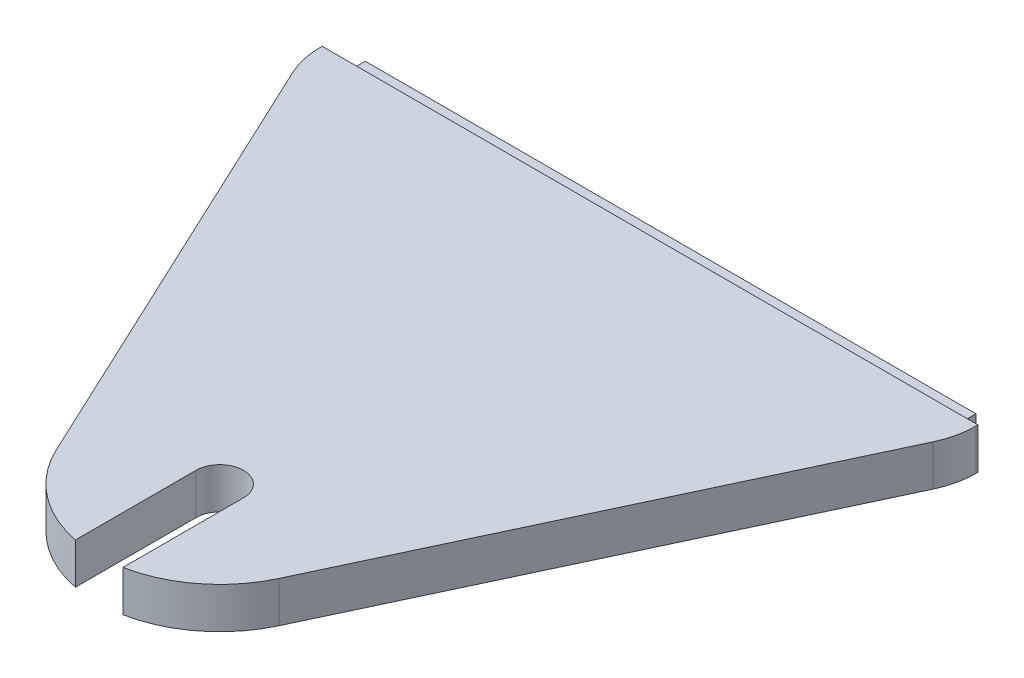
ISO-10303-21;
HEADER;
FILE_DESCRIPTION(('STEP AP214'),'2;1');
FILE_NAME('part.step','',(''),(''),'','','');
FILE_SCHEMA(('AUTOMOTIVE_DESIGN { 1 0 10303 214 1 1 1 1 }'));
ENDSEC;
DATA;
#1=APPLICATION_CONTEXT('core data for automotive mechanical design processes');
#2=APPLICATION_PROTOCOL_DEFINITION('international standard','automotive_design',2000,#1);
#3=PRODUCT_CONTEXT('',#1,'mechanical');
#4=PRODUCT('Part','Part','',(#3));
#5=PRODUCT_RELATED_PRODUCT_CATEGORY('part','',(#4));
#6=PRODUCT_DEFINITION_FORMATION('','',#4);
#7=PRODUCT_DEFINITION_CONTEXT('part definition',#1,'design');
#8=PRODUCT_DEFINITION('design','',#6,#7);
#9=PRODUCT_DEFINITION_SHAPE('','',#8);
#10=(LENGTH_UNIT() NAMED_UNIT(*) SI_UNIT(.MILLI.,.METRE.));
#11=(NAMED_UNIT(*) PLANE_ANGLE_UNIT() SI_UNIT($,.RADIAN.));
#12=(NAMED_UNIT(*) SI_UNIT($,.STERADIAN.) SOLID_ANGLE_UNIT());
#13=UNCERTAINTY_MEASURE_WITH_UNIT(LENGTH_MEASURE(1.E-05),#10,'distance_accuracy_value','');
#14=(GEOMETRIC_REPRESENTATION_CONTEXT(3) GLOBAL_UNCERTAINTY_ASSIGNED_CONTEXT((#13)) GLOBAL_UNIT_ASSIGNED_CONTEXT((#10,
#11,#12)) REPRESENTATION_CONTEXT('',''));
#15=CARTESIAN_POINT('',(0.,0.,0.));
#16=DIRECTION('',(0.,0.,1.));
#17=DIRECTION('',(1.,0.,0.));
#18=AXIS2_PLACEMENT_3D('',#15,#16,#17);
#19=CARTESIAN_POINT('',(0.,5.,50.));
#20=DIRECTION('',(0.,-1.,0.));
#21=DIRECTION('',(0.,0.,-1.));
#22=AXIS2_PLACEMENT_3D('',#19,#20,#21);
#23=CYLINDRICAL_SURFACE('',#22,15.);
#24=DIRECTION('',(0.,-1.,0.));
#25=VECTOR('',#24,1.);
#26=CARTESIAN_POINT('',(-2.9,5.,64.7169969762856));
#27=LINE('',#26,#25);
#28=CARTESIAN_POINT('',(-2.9,5.,64.7169969762856));
#29=VERTEX_POINT('',#28);
#30=CARTESIAN_POINT('',(-2.9,0.,64.7169969762856));
#31=VERTEX_POINT('',#30);
#32=EDGE_CURVE('E158',#29,#31,#27,.T.);
#33=ORIENTED_EDGE('',*,*,#32,.F.);
#34=CARTESIAN_POINT('',(0.,5.,50.));
#35=DIRECTION('',(0.,1.,0.));
#36=DIRECTION('',(0.,0.,1.));
#37=AXIS2_PLACEMENT_3D('',#34,#35,#36);
#38=CIRCLE('',#37,15.);
#39=CARTESIAN_POINT('',(-13.5822252420629,5.,56.3657801936503));
#40=VERTEX_POINT('',#39);
#41=EDGE_CURVE('E172',#40,#29,#38,.T.);
#42=ORIENTED_EDGE('',*,*,#41,.F.);
#43=DIRECTION('',(0.,-1.,0.));
#44=VECTOR('',#43,1.);
#45=CARTESIAN_POINT('',(-13.5822252420629,5.,56.3657801936503));
#46=LINE('',#45,#44);
#47=CARTESIAN_POINT('',(-13.5822252420629,0.,56.3657801936503));
#48=VERTEX_POINT('',#47);
#49=EDGE_CURVE('E192',#40,#48,#46,.T.);
#50=ORIENTED_EDGE('',*,*,#49,.T.);
#51=CARTESIAN_POINT('',(0.,0.,50.));
#52=DIRECTION('',(0.,1.,0.));
#53=DIRECTION('',(0.,0.,1.));
#54=AXIS2_PLACEMENT_3D('',#51,#52,#53);
#55=CIRCLE('',#54,15.);
#56=EDGE_CURVE('E188',#48,#31,#55,.T.);
#57=ORIENTED_EDGE('',*,*,#56,.T.);
#58=EDGE_LOOP('',(#33,#42,#50,#57));
#59=FACE_BOUND('',#58,.T.);
#60=ADVANCED_FACE('F39',(#59),#23,.T.);
#61=CARTESIAN_POINT('',(0.,0.,50.));
#62=DIRECTION('',(0.,1.,0.));
#63=DIRECTION('',(0.,0.,1.));
#64=AXIS2_PLACEMENT_3D('',#61,#62,#63);
#65=PLANE('',#64);
#66=DIRECTION('',(0.,0.,1.));
#67=VECTOR('',#66,1.);
#68=CARTESIAN_POINT('',(2.9,0.,50.));
#69=LINE('',#68,#67);
#70=CARTESIAN_POINT('',(2.9,0.,50.));
#71=VERTEX_POINT('',#70);
#72=CARTESIAN_POINT('',(2.9,0.,64.7169969762856));
#73=VERTEX_POINT('',#72);
#74=EDGE_CURVE('E152',#71,#73,#69,.T.);
#75=ORIENTED_EDGE('',*,*,#74,.F.);
#76=CARTESIAN_POINT('',(0.,0.,50.));
#77=DIRECTION('',(0.,-1.,0.));
#78=DIRECTION('',(0.,0.,-1.));
#79=AXIS2_PLACEMENT_3D('',#76,#77,#78);
#80=CIRCLE('',#79,2.9);
#81=CARTESIAN_POINT('',(-2.9,0.,50.));
#82=VERTEX_POINT('',#81);
#83=EDGE_CURVE('E276',#82,#71,#80,.T.);
#84=ORIENTED_EDGE('',*,*,#83,.F.);
#85=DIRECTION('',(0.,0.,-1.));
#86=VECTOR('',#85,1.);
#87=CARTESIAN_POINT('',(-2.9,0.,50.));
#88=LINE('',#87,#86);
#89=EDGE_CURVE('E274',#31,#82,#88,.T.);
#90=ORIENTED_EDGE('',*,*,#89,.F.);
#91=ORIENTED_EDGE('',*,*,#56,.F.);
#92=DIRECTION('',(0.424385346243353,0.,0.905481682804191));
#93=VECTOR('',#92,1.);
#94=CARTESIAN_POINT('',(-40.,0.,0.));
#95=LINE('',#94,#93);
#96=CARTESIAN_POINT('',(-39.0548168280419,0.,2.0166720097165));
#97=VERTEX_POINT('',#96);
#98=EDGE_CURVE('E180',#97,#48,#95,.T.);
#99=ORIENTED_EDGE('',*,*,#98,.F.);
#100=CARTESIAN_POINT('',(-30.,0.,-2.22718145271703));
#101=DIRECTION('',(0.,1.,0.));
#102=DIRECTION('',(0.,0.,1.));
#103=AXIS2_PLACEMENT_3D('',#100,#101,#102);
#104=CIRCLE('',#103,10.);
#105=CARTESIAN_POINT('',(-40.,0.,-2.22718145271703));
#106=VERTEX_POINT('',#105);
#107=EDGE_CURVE('E205',#97,#106,#104,.F.);
#108=ORIENTED_EDGE('',*,*,#107,.T.);
#109=DIRECTION('',(0.,0.,1.));
#110=VECTOR('',#109,1.);
#111=CARTESIAN_POINT('',(-40.,0.,-5.));
#112=LINE('',#111,#110);
#113=CARTESIAN_POINT('',(-40.,0.,-2.5));
#114=VERTEX_POINT('',#113);
#115=EDGE_CURVE('E224',#114,#106,#112,.T.);
#116=ORIENTED_EDGE('',*,*,#115,.F.);
#117=DIRECTION('',(-1.,0.,0.));
#118=VECTOR('',#117,1.);
#119=CARTESIAN_POINT('',(40.,0.,-2.5));
#120=LINE('',#119,#118);
#121=CARTESIAN_POINT('',(40.,0.,-2.5));
#122=VERTEX_POINT('',#121);
#123=EDGE_CURVE('E225',#122,#114,#120,.T.);
#124=ORIENTED_EDGE('',*,*,#123,.F.);
#125=DIRECTION('',(0.,0.,1.));
#126=VECTOR('',#125,1.);
#127=CARTESIAN_POINT('',(40.,0.,-5.));
#128=LINE('',#127,#126);
#129=CARTESIAN_POINT('',(40.,0.,-2.22718145271703));
#130=VERTEX_POINT('',#129);
#131=EDGE_CURVE('E190',#122,#130,#128,.T.);
#132=ORIENTED_EDGE('',*,*,#131,.T.);
#133=CARTESIAN_POINT('',(30.,0.,-2.22718145271703));
#134=DIRECTION('',(0.,1.,0.));
#135=DIRECTION('',(0.,0.,1.));
#136=AXIS2_PLACEMENT_3D('',#133,#134,#135);
#137=CIRCLE('',#136,10.);
#138=CARTESIAN_POINT('',(39.0548168280419,0.,2.0166720097165));
#139=VERTEX_POINT('',#138);
#140=EDGE_CURVE('E199',#130,#139,#137,.F.);
#141=ORIENTED_EDGE('',*,*,#140,.T.);
#142=DIRECTION('',(-0.424385346243353,0.,0.905481682804191));
#143=VECTOR('',#142,1.);
#144=CARTESIAN_POINT('',(40.,0.,0.));
#145=LINE('',#144,#143);
#146=CARTESIAN_POINT('',(13.5822252420629,0.,56.3657801936503));
#147=VERTEX_POINT('',#146);
#148=EDGE_CURVE('E184',#139,#147,#145,.T.);
#149=ORIENTED_EDGE('',*,*,#148,.T.);
#150=EDGE_CURVE('E186',#73,#147,#55,.T.);
#151=ORIENTED_EDGE('',*,*,#150,.F.);
#152=EDGE_LOOP('',(#75,#84,#90,#91,#99,#108,#116,#124,#132,#141,#149,#151));
#153=FACE_BOUND('',#152,.T.);
#154=ADVANCED_FACE('F218',(#153),#65,.F.);
#155=CARTESIAN_POINT('',(0.,5.,50.));
#156=DIRECTION('',(0.,1.,0.));
#157=DIRECTION('',(0.,0.,1.));
#158=AXIS2_PLACEMENT_3D('',#155,#156,#157);
#159=PLANE('',#158);
#160=ORIENTED_EDGE('',*,*,#41,.T.);
#161=DIRECTION('',(0.,0.,-1.));
#162=VECTOR('',#161,1.);
#163=CARTESIAN_POINT('',(-2.9,5.,50.));
#164=LINE('',#163,#162);
#165=CARTESIAN_POINT('',(-2.9,5.,50.));
#166=VERTEX_POINT('',#165);
#167=EDGE_CURVE('E166',#29,#166,#164,.T.);
#168=ORIENTED_EDGE('',*,*,#167,.T.);
#169=CARTESIAN_POINT('',(0.,5.,50.));
#170=DIRECTION('',(0.,-1.,0.));
#171=DIRECTION('',(0.,0.,-1.));
#172=AXIS2_PLACEMENT_3D('',#169,#170,#171);
#173=CIRCLE('',#172,2.9);
#174=CARTESIAN_POINT('',(2.9,5.,50.));
#175=VERTEX_POINT('',#174);
#176=EDGE_CURVE('E169',#166,#175,#173,.T.);
#177=ORIENTED_EDGE('',*,*,#176,.T.);
#178=DIRECTION('',(0.,0.,1.));
#179=VECTOR('',#178,1.);
#180=CARTESIAN_POINT('',(2.9,5.,50.));
#181=LINE('',#180,#179);
#182=CARTESIAN_POINT('',(2.9,5.,64.7169969762856));
#183=VERTEX_POINT('',#182);
#184=EDGE_CURVE('E53',#175,#183,#181,.T.);
#185=ORIENTED_EDGE('',*,*,#184,.T.);
#186=CARTESIAN_POINT('',(13.5822252420629,5.,56.3657801936503));
#187=VERTEX_POINT('',#186);
#188=EDGE_CURVE('E163',#183,#187,#38,.T.);
#189=ORIENTED_EDGE('',*,*,#188,.T.);
#190=DIRECTION('',(-0.424385346243353,0.,0.905481682804191));
#191=VECTOR('',#190,1.);
#192=CARTESIAN_POINT('',(40.,5.,0.));
#193=LINE('',#192,#191);
#194=CARTESIAN_POINT('',(39.0548168280419,5.,2.0166720097165));
#195=VERTEX_POINT('',#194);
#196=EDGE_CURVE('E178',#195,#187,#193,.T.);
#197=ORIENTED_EDGE('',*,*,#196,.F.);
#198=CARTESIAN_POINT('',(30.,5.,-2.22718145271703));
#199=DIRECTION('',(0.,1.,0.));
#200=DIRECTION('',(0.,0.,1.));
#201=AXIS2_PLACEMENT_3D('',#198,#199,#200);
#202=CIRCLE('',#201,10.);
#203=CARTESIAN_POINT('',(40.,5.,-2.22718145271703));
#204=VERTEX_POINT('',#203);
#205=EDGE_CURVE('E61',#195,#204,#202,.T.);
#206=ORIENTED_EDGE('',*,*,#205,.T.);
#207=DIRECTION('',(0.,0.,1.));
#208=VECTOR('',#207,1.);
#209=CARTESIAN_POINT('',(40.,5.,-5.));
#210=LINE('',#209,#208);
#211=CARTESIAN_POINT('',(40.,5.,-2.5));
#212=VERTEX_POINT('',#211);
#213=EDGE_CURVE('E214',#212,#204,#210,.T.);
#214=ORIENTED_EDGE('',*,*,#213,.F.);
#215=DIRECTION('',(1.,0.,0.));
#216=VECTOR('',#215,1.);
#217=CARTESIAN_POINT('',(40.,5.,-2.5));
#218=LINE('',#217,#216);
#219=CARTESIAN_POINT('',(-40.,5.,-2.5));
#220=VERTEX_POINT('',#219);
#221=EDGE_CURVE('E233',#220,#212,#218,.T.);
#222=ORIENTED_EDGE('',*,*,#221,.F.);
#223=DIRECTION('',(0.,0.,1.));
#224=VECTOR('',#223,1.);
#225=CARTESIAN_POINT('',(-40.,5.,-5.));
#226=LINE('',#225,#224);
#227=CARTESIAN_POINT('',(-40.,5.,-2.22718145271703));
#228=VERTEX_POINT('',#227);
#229=EDGE_CURVE('E223',#220,#228,#226,.T.);
#230=ORIENTED_EDGE('',*,*,#229,.T.);
#231=CARTESIAN_POINT('',(-30.,5.,-2.22718145271703));
#232=DIRECTION('',(0.,1.,0.));
#233=DIRECTION('',(0.,0.,1.));
#234=AXIS2_PLACEMENT_3D('',#231,#232,#233);
#235=CIRCLE('',#234,10.);
#236=CARTESIAN_POINT('',(-39.0548168280419,5.,2.0166720097165));
#237=VERTEX_POINT('',#236);
#238=EDGE_CURVE('E210',#228,#237,#235,.T.);
#239=ORIENTED_EDGE('',*,*,#238,.T.);
#240=DIRECTION('',(0.424385346243353,0.,0.905481682804191));
#241=VECTOR('',#240,1.);
#242=CARTESIAN_POINT('',(-40.,5.,0.));
#243=LINE('',#242,#241);
#244=EDGE_CURVE('E177',#237,#40,#243,.T.);
#245=ORIENTED_EDGE('',*,*,#244,.T.);
#246=EDGE_LOOP('',(#160,#168,#177,#185,#189,#197,#206,#214,#222,#230,#239,#245));
#247=FACE_BOUND('',#246,.T.);
#248=ADVANCED_FACE('F162',(#247),#159,.T.);
#249=CARTESIAN_POINT('',(40.,5.,-5.));
#250=DIRECTION('',(-1.,0.,0.));
#251=DIRECTION('',(0.,0.,1.));
#252=AXIS2_PLACEMENT_3D('',#249,#250,#251);
#253=PLANE('',#252);
#254=ORIENTED_EDGE('',*,*,#213,.T.);
#255=DIRECTION('',(0.,-1.,0.));
#256=VECTOR('',#255,1.);
#257=CARTESIAN_POINT('',(40.,0.,-2.22718145271703));
#258=LINE('',#257,#256);
#259=EDGE_CURVE('E50',#204,#130,#258,.T.);
#260=ORIENTED_EDGE('',*,*,#259,.T.);
#261=ORIENTED_EDGE('',*,*,#131,.F.);
#262=DIRECTION('',(0.,-1.,0.));
#263=VECTOR('',#262,1.);
#264=CARTESIAN_POINT('',(40.,5.,-2.5));
#265=LINE('',#264,#263);
#266=EDGE_CURVE('E237',#212,#122,#265,.T.);
#267=ORIENTED_EDGE('',*,*,#266,.F.);
#268=EDGE_LOOP('',(#254,#260,#261,#267));
#269=FACE_BOUND('',#268,.T.);
#270=ADVANCED_FACE('F213',(#269),#253,.F.);
#271=CARTESIAN_POINT('',(-40.,5.,0.));
#272=DIRECTION('',(0.905481682804191,0.,-0.424385346243353));
#273=DIRECTION('',(-0.424385346243353,0.,-0.905481682804191));
#274=AXIS2_PLACEMENT_3D('',#271,#272,#273);
#275=PLANE('',#274);
#276=ORIENTED_EDGE('',*,*,#244,.F.);
#277=DIRECTION('',(0.,-1.,0.));
#278=VECTOR('',#277,1.);
#279=CARTESIAN_POINT('',(-39.0548168280419,0.,2.0166720097165));
#280=LINE('',#279,#278);
#281=EDGE_CURVE('E198',#237,#97,#280,.T.);
#282=ORIENTED_EDGE('',*,*,#281,.T.);
#283=ORIENTED_EDGE('',*,*,#98,.T.);
#284=ORIENTED_EDGE('',*,*,#49,.F.);
#285=EDGE_LOOP('',(#276,#282,#283,#284));
#286=FACE_BOUND('',#285,.T.);
#287=ADVANCED_FACE('F312',(#286),#275,.F.);
#288=ORIENTED_EDGE('',*,*,#188,.F.);
#289=DIRECTION('',(0.,-1.,0.));
#290=VECTOR('',#289,1.);
#291=CARTESIAN_POINT('',(2.9,5.,64.7169969762856));
#292=LINE('',#291,#290);
#293=EDGE_CURVE('E151',#183,#73,#292,.T.);
#294=ORIENTED_EDGE('',*,*,#293,.T.);
#295=ORIENTED_EDGE('',*,*,#150,.T.);
#296=DIRECTION('',(0.,-1.,0.));
#297=VECTOR('',#296,1.);
#298=CARTESIAN_POINT('',(13.5822252420629,5.,56.3657801936503));
#299=LINE('',#298,#297);
#300=EDGE_CURVE('E173',#187,#147,#299,.T.);
#301=ORIENTED_EDGE('',*,*,#300,.F.);
#302=EDGE_LOOP('',(#288,#294,#295,#301));
#303=FACE_BOUND('',#302,.T.);
#304=ADVANCED_FACE('F171',(#303),#23,.T.);
#305=CARTESIAN_POINT('',(40.,5.,0.));
#306=DIRECTION('',(0.905481682804191,0.,0.424385346243353));
#307=DIRECTION('',(0.424385346243353,0.,-0.905481682804191));
#308=AXIS2_PLACEMENT_3D('',#305,#306,#307);
#309=PLANE('',#308);
#310=ORIENTED_EDGE('',*,*,#148,.F.);
#311=DIRECTION('',(0.,-1.,0.));
#312=VECTOR('',#311,1.);
#313=CARTESIAN_POINT('',(39.0548168280419,5.,2.0166720097165));
#314=LINE('',#313,#312);
#315=EDGE_CURVE('E11',#139,#195,#314,.F.);
#316=ORIENTED_EDGE('',*,*,#315,.T.);
#317=ORIENTED_EDGE('',*,*,#196,.T.);
#318=ORIENTED_EDGE('',*,*,#300,.T.);
#319=EDGE_LOOP('',(#310,#316,#317,#318));
#320=FACE_BOUND('',#319,.T.);
#321=ADVANCED_FACE('F314',(#320),#309,.T.);
#322=CARTESIAN_POINT('',(-40.,5.,-5.));
#323=DIRECTION('',(-1.,0.,0.));
#324=DIRECTION('',(0.,0.,1.));
#325=AXIS2_PLACEMENT_3D('',#322,#323,#324);
#326=PLANE('',#325);
#327=ORIENTED_EDGE('',*,*,#115,.T.);
#328=DIRECTION('',(0.,-1.,0.));
#329=VECTOR('',#328,1.);
#330=CARTESIAN_POINT('',(-40.,5.,-2.22718145271703));
#331=LINE('',#330,#329);
#332=EDGE_CURVE('E204',#106,#228,#331,.F.);
#333=ORIENTED_EDGE('',*,*,#332,.T.);
#334=ORIENTED_EDGE('',*,*,#229,.F.);
#335=DIRECTION('',(0.,1.,0.));
#336=VECTOR('',#335,1.);
#337=CARTESIAN_POINT('',(-40.,5.,-2.5));
#338=LINE('',#337,#336);
#339=EDGE_CURVE('E232',#114,#220,#338,.T.);
#340=ORIENTED_EDGE('',*,*,#339,.F.);
#341=EDGE_LOOP('',(#327,#333,#334,#340));
#342=FACE_BOUND('',#341,.T.);
#343=ADVANCED_FACE('F319',(#342),#326,.T.);
#344=CARTESIAN_POINT('',(0.,0.,-2.5));
#345=DIRECTION('',(0.,0.,-1.));
#346=DIRECTION('',(-1.,0.,0.));
#347=AXIS2_PLACEMENT_3D('',#344,#345,#346);
#348=PLANE('',#347);
#349=DIRECTION('',(-1.,0.,0.));
#350=VECTOR('',#349,1.);
#351=CARTESIAN_POINT('',(37.25,1.45,-2.5));
#352=LINE('',#351,#350);
#353=CARTESIAN_POINT('',(37.25,1.45,-2.5));
#354=VERTEX_POINT('',#353);
#355=CARTESIAN_POINT('',(-37.25,1.45,-2.5));
#356=VERTEX_POINT('',#355);
#357=EDGE_CURVE('E241',#354,#356,#352,.T.);
#358=ORIENTED_EDGE('',*,*,#357,.F.);
#359=DIRECTION('',(0.,-1.,0.));
#360=VECTOR('',#359,1.);
#361=CARTESIAN_POINT('',(37.25,3.55,-2.5));
#362=LINE('',#361,#360);
#363=CARTESIAN_POINT('',(37.25,3.55,-2.5));
#364=VERTEX_POINT('',#363);
#365=EDGE_CURVE('E262',#364,#354,#362,.T.);
#366=ORIENTED_EDGE('',*,*,#365,.F.);
#367=DIRECTION('',(1.,0.,0.));
#368=VECTOR('',#367,1.);
#369=CARTESIAN_POINT('',(37.25,3.55,-2.5));
#370=LINE('',#369,#368);
#371=CARTESIAN_POINT('',(-37.25,3.55,-2.5));
#372=VERTEX_POINT('',#371);
#373=EDGE_CURVE('E270',#372,#364,#370,.T.);
#374=ORIENTED_EDGE('',*,*,#373,.F.);
#375=DIRECTION('',(0.,1.,0.));
#376=VECTOR('',#375,1.);
#377=CARTESIAN_POINT('',(-37.25,3.55,-2.5));
#378=LINE('',#377,#376);
#379=EDGE_CURVE('E253',#356,#372,#378,.T.);
#380=ORIENTED_EDGE('',*,*,#379,.F.);
#381=EDGE_LOOP('',(#358,#366,#374,#380));
#382=FACE_BOUND('',#381,.T.);
#383=ORIENTED_EDGE('',*,*,#266,.T.);
#384=ORIENTED_EDGE('',*,*,#123,.T.);
#385=ORIENTED_EDGE('',*,*,#339,.T.);
#386=ORIENTED_EDGE('',*,*,#221,.T.);
#387=EDGE_LOOP('',(#383,#384,#385,#386));
#388=FACE_BOUND('',#387,.T.);
#389=ADVANCED_FACE('F334',(#382,#388),#348,.T.);
#390=CARTESIAN_POINT('',(-37.25,3.55,-2.5));
#391=DIRECTION('',(-1.,0.,0.));
#392=DIRECTION('',(0.,0.,1.));
#393=AXIS2_PLACEMENT_3D('',#390,#391,#392);
#394=PLANE('',#393);
#395=DIRECTION('',(0.,1.,0.));
#396=VECTOR('',#395,1.);
#397=CARTESIAN_POINT('',(-37.25,3.55,-5.));
#398=LINE('',#397,#396);
#399=CARTESIAN_POINT('',(-37.25,1.45,-5.));
#400=VERTEX_POINT('',#399);
#401=CARTESIAN_POINT('',(-37.25,3.55,-5.));
#402=VERTEX_POINT('',#401);
#403=EDGE_CURVE('E256',#400,#402,#398,.T.);
#404=ORIENTED_EDGE('',*,*,#403,.F.);
#405=DIRECTION('',(0.,0.,-1.));
#406=VECTOR('',#405,1.);
#407=CARTESIAN_POINT('',(-37.25,1.45,-2.5));
#408=LINE('',#407,#406);
#409=EDGE_CURVE('E236',#356,#400,#408,.T.);
#410=ORIENTED_EDGE('',*,*,#409,.F.);
#411=ORIENTED_EDGE('',*,*,#379,.T.);
#412=DIRECTION('',(0.,0.,-1.));
#413=VECTOR('',#412,1.);
#414=CARTESIAN_POINT('',(-37.25,3.55,-2.5));
#415=LINE('',#414,#413);
#416=EDGE_CURVE('E239',#372,#402,#415,.T.);
#417=ORIENTED_EDGE('',*,*,#416,.T.);
#418=EDGE_LOOP('',(#404,#410,#411,#417));
#419=FACE_BOUND('',#418,.T.);
#420=ADVANCED_FACE('F344',(#419),#394,.T.);
#421=CARTESIAN_POINT('',(37.25,1.45,-2.5));
#422=DIRECTION('',(0.,-1.,0.));
#423=DIRECTION('',(0.,0.,-1.));
#424=AXIS2_PLACEMENT_3D('',#421,#422,#423);
#425=PLANE('',#424);
#426=DIRECTION('',(-1.,0.,0.));
#427=VECTOR('',#426,1.);
#428=CARTESIAN_POINT('',(37.25,1.45,-5.));
#429=LINE('',#428,#427);
#430=CARTESIAN_POINT('',(37.25,1.45,-5.));
#431=VERTEX_POINT('',#430);
#432=EDGE_CURVE('E247',#431,#400,#429,.T.);
#433=ORIENTED_EDGE('',*,*,#432,.F.);
#434=DIRECTION('',(0.,0.,-1.));
#435=VECTOR('',#434,1.);
#436=CARTESIAN_POINT('',(37.25,1.45,-2.5));
#437=LINE('',#436,#435);
#438=EDGE_CURVE('E242',#354,#431,#437,.T.);
#439=ORIENTED_EDGE('',*,*,#438,.F.);
#440=ORIENTED_EDGE('',*,*,#357,.T.);
#441=ORIENTED_EDGE('',*,*,#409,.T.);
#442=EDGE_LOOP('',(#433,#439,#440,#441));
#443=FACE_BOUND('',#442,.T.);
#444=ADVANCED_FACE('F347',(#443),#425,.T.);
#445=CARTESIAN_POINT('',(37.25,3.55,-2.5));
#446=DIRECTION('',(1.,0.,0.));
#447=DIRECTION('',(0.,0.,-1.));
#448=AXIS2_PLACEMENT_3D('',#445,#446,#447);
#449=PLANE('',#448);
#450=DIRECTION('',(0.,-1.,0.));
#451=VECTOR('',#450,1.);
#452=CARTESIAN_POINT('',(37.25,3.55,-5.));
#453=LINE('',#452,#451);
#454=CARTESIAN_POINT('',(37.25,3.55,-5.));
#455=VERTEX_POINT('',#454);
#456=EDGE_CURVE('E252',#455,#431,#453,.T.);
#457=ORIENTED_EDGE('',*,*,#456,.F.);
#458=DIRECTION('',(0.,0.,-1.));
#459=VECTOR('',#458,1.);
#460=CARTESIAN_POINT('',(37.25,3.55,-2.5));
#461=LINE('',#460,#459);
#462=EDGE_CURVE('E244',#364,#455,#461,.T.);
#463=ORIENTED_EDGE('',*,*,#462,.F.);
#464=ORIENTED_EDGE('',*,*,#365,.T.);
#465=ORIENTED_EDGE('',*,*,#438,.T.);
#466=EDGE_LOOP('',(#457,#463,#464,#465));
#467=FACE_BOUND('',#466,.T.);
#468=ADVANCED_FACE('F348',(#467),#449,.T.);
#469=CARTESIAN_POINT('',(37.25,3.55,-2.5));
#470=DIRECTION('',(0.,1.,0.));
#471=DIRECTION('',(0.,0.,1.));
#472=AXIS2_PLACEMENT_3D('',#469,#470,#471);
#473=PLANE('',#472);
#474=DIRECTION('',(1.,0.,0.));
#475=VECTOR('',#474,1.);
#476=CARTESIAN_POINT('',(37.25,3.55,-5.));
#477=LINE('',#476,#475);
#478=EDGE_CURVE('E254',#402,#455,#477,.T.);
#479=ORIENTED_EDGE('',*,*,#478,.F.);
#480=ORIENTED_EDGE('',*,*,#416,.F.);
#481=ORIENTED_EDGE('',*,*,#373,.T.);
#482=ORIENTED_EDGE('',*,*,#462,.T.);
#483=EDGE_LOOP('',(#479,#480,#481,#482));
#484=FACE_BOUND('',#483,.T.);
#485=ADVANCED_FACE('F340',(#484),#473,.T.);
#486=CARTESIAN_POINT('',(0.,0.,-5.));
#487=DIRECTION('',(0.,0.,-1.));
#488=DIRECTION('',(-1.,0.,0.));
#489=AXIS2_PLACEMENT_3D('',#486,#487,#488);
#490=PLANE('',#489);
#491=ORIENTED_EDGE('',*,*,#432,.T.);
#492=ORIENTED_EDGE('',*,*,#403,.T.);
#493=ORIENTED_EDGE('',*,*,#478,.T.);
#494=ORIENTED_EDGE('',*,*,#456,.T.);
#495=EDGE_LOOP('',(#491,#492,#493,#494));
#496=FACE_BOUND('',#495,.T.);
#497=ADVANCED_FACE('F333',(#496),#490,.T.);
#498=CARTESIAN_POINT('',(-30.,5.,-2.22718145271703));
#499=DIRECTION('',(0.,1.,0.));
#500=DIRECTION('',(0.,0.,1.));
#501=AXIS2_PLACEMENT_3D('',#498,#499,#500);
#502=CYLINDRICAL_SURFACE('',#501,10.);
#503=ORIENTED_EDGE('',*,*,#238,.F.);
#504=ORIENTED_EDGE('',*,*,#332,.F.);
#505=ORIENTED_EDGE('',*,*,#107,.F.);
#506=ORIENTED_EDGE('',*,*,#281,.F.);
#507=EDGE_LOOP('',(#503,#504,#505,#506));
#508=FACE_BOUND('',#507,.T.);
#509=ADVANCED_FACE('F302',(#508),#502,.T.);
#510=CARTESIAN_POINT('',(30.,5.,-2.22718145271703));
#511=DIRECTION('',(0.,1.,0.));
#512=DIRECTION('',(0.,0.,1.));
#513=AXIS2_PLACEMENT_3D('',#510,#511,#512);
#514=CYLINDRICAL_SURFACE('',#513,10.);
#515=ORIENTED_EDGE('',*,*,#205,.F.);
#516=ORIENTED_EDGE('',*,*,#315,.F.);
#517=ORIENTED_EDGE('',*,*,#140,.F.);
#518=ORIENTED_EDGE('',*,*,#259,.F.);
#519=EDGE_LOOP('',(#515,#516,#517,#518));
#520=FACE_BOUND('',#519,.T.);
#521=ADVANCED_FACE('F41',(#520),#514,.T.);
#522=CARTESIAN_POINT('',(0.,5.,50.));
#523=DIRECTION('',(0.,-1.,0.));
#524=DIRECTION('',(0.,0.,-1.));
#525=AXIS2_PLACEMENT_3D('',#522,#523,#524);
#526=CYLINDRICAL_SURFACE('',#525,2.9);
#527=ORIENTED_EDGE('',*,*,#83,.T.);
#528=DIRECTION('',(0.,-1.,0.));
#529=VECTOR('',#528,1.);
#530=CARTESIAN_POINT('',(2.9,5.,50.));
#531=LINE('',#530,#529);
#532=EDGE_CURVE('E157',#175,#71,#531,.T.);
#533=ORIENTED_EDGE('',*,*,#532,.F.);
#534=ORIENTED_EDGE('',*,*,#176,.F.);
#535=DIRECTION('',(0.,-1.,0.));
#536=VECTOR('',#535,1.);
#537=CARTESIAN_POINT('',(-2.9,5.,50.));
#538=LINE('',#537,#536);
#539=EDGE_CURVE('E261',#166,#82,#538,.T.);
#540=ORIENTED_EDGE('',*,*,#539,.T.);
#541=EDGE_LOOP('',(#527,#533,#534,#540));
#542=FACE_BOUND('',#541,.T.);
#543=ADVANCED_FACE('F294',(#542),#526,.F.);
#544=CARTESIAN_POINT('',(-2.9,5.,50.));
#545=DIRECTION('',(-1.,0.,0.));
#546=DIRECTION('',(0.,0.,1.));
#547=AXIS2_PLACEMENT_3D('',#544,#545,#546);
#548=PLANE('',#547);
#549=ORIENTED_EDGE('',*,*,#89,.T.);
#550=ORIENTED_EDGE('',*,*,#539,.F.);
#551=ORIENTED_EDGE('',*,*,#167,.F.);
#552=ORIENTED_EDGE('',*,*,#32,.T.);
#553=EDGE_LOOP('',(#549,#550,#551,#552));
#554=FACE_BOUND('',#553,.T.);
#555=ADVANCED_FACE('F288',(#554),#548,.F.);
#556=CARTESIAN_POINT('',(2.9,5.,50.));
#557=DIRECTION('',(1.,0.,0.));
#558=DIRECTION('',(0.,0.,-1.));
#559=AXIS2_PLACEMENT_3D('',#556,#557,#558);
#560=PLANE('',#559);
#561=ORIENTED_EDGE('',*,*,#74,.T.);
#562=ORIENTED_EDGE('',*,*,#293,.F.);
#563=ORIENTED_EDGE('',*,*,#184,.F.);
#564=ORIENTED_EDGE('',*,*,#532,.T.);
#565=EDGE_LOOP('',(#561,#562,#563,#564));
#566=FACE_BOUND('',#565,.T.);
#567=ADVANCED_FACE('F155',(#566),#560,.F.);
#568=CLOSED_SHELL('',(#60,#154,#248,#270,#287,#304,#321,#343,#389,#420,#444,#468,#485,#497,#509,
#521,#543,#555,#567));
#569=MANIFOLD_SOLID_BREP('B2',#568);
#570=ADVANCED_BREP_SHAPE_REPRESENTATION('',(#18,#569),#14);
#571=SHAPE_DEFINITION_REPRESENTATION(#9,#570);
ENDSEC;
END-ISO-10303-21;
